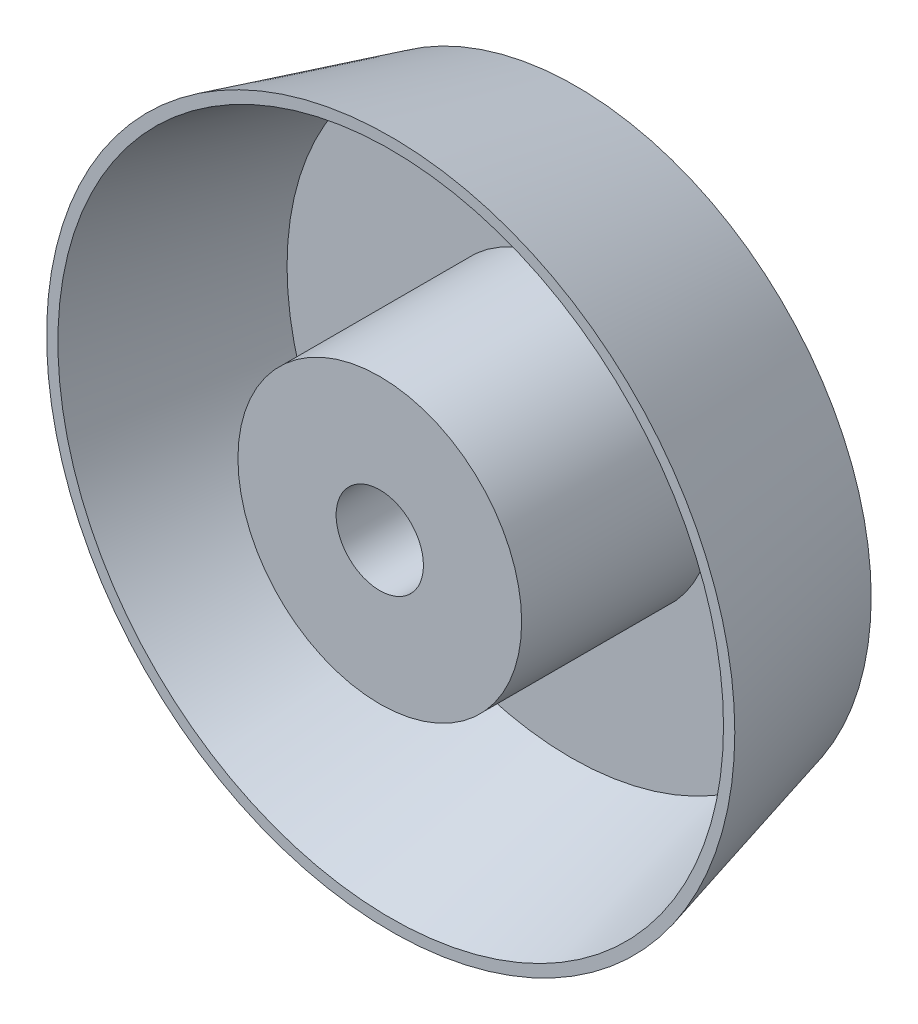
ISO-10303-21;
HEADER;
FILE_DESCRIPTION(('STEP AP214'),'2;1');
FILE_NAME('part.step','',(''),(''),'','','');
FILE_SCHEMA(('AUTOMOTIVE_DESIGN { 1 0 10303 214 1 1 1 1 }'));
ENDSEC;
DATA;
#1=APPLICATION_CONTEXT('core data for automotive mechanical design processes');
#2=APPLICATION_PROTOCOL_DEFINITION('international standard','automotive_design',2000,#1);
#3=PRODUCT_CONTEXT('',#1,'mechanical');
#4=PRODUCT('Part','Part','',(#3));
#5=PRODUCT_RELATED_PRODUCT_CATEGORY('part','',(#4));
#6=PRODUCT_DEFINITION_FORMATION('','',#4);
#7=PRODUCT_DEFINITION_CONTEXT('part definition',#1,'design');
#8=PRODUCT_DEFINITION('design','',#6,#7);
#9=PRODUCT_DEFINITION_SHAPE('','',#8);
#10=(LENGTH_UNIT() NAMED_UNIT(*) SI_UNIT(.MILLI.,.METRE.));
#11=(NAMED_UNIT(*) PLANE_ANGLE_UNIT() SI_UNIT($,.RADIAN.));
#12=(NAMED_UNIT(*) SI_UNIT($,.STERADIAN.) SOLID_ANGLE_UNIT());
#13=UNCERTAINTY_MEASURE_WITH_UNIT(LENGTH_MEASURE(1.E-05),#10,'distance_accuracy_value','');
#14=(GEOMETRIC_REPRESENTATION_CONTEXT(3) GLOBAL_UNCERTAINTY_ASSIGNED_CONTEXT((#13)) GLOBAL_UNIT_ASSIGNED_CONTEXT((#10,
#11,#12)) REPRESENTATION_CONTEXT('',''));
#15=CARTESIAN_POINT('',(0.,0.,0.));
#16=DIRECTION('',(0.,0.,1.));
#17=DIRECTION('',(1.,0.,0.));
#18=AXIS2_PLACEMENT_3D('',#15,#16,#17);
#19=CARTESIAN_POINT('',(0.,0.,0.));
#20=DIRECTION('',(0.,0.,1.));
#21=DIRECTION('',(1.,0.,0.));
#22=AXIS2_PLACEMENT_3D('',#19,#20,#21);
#23=PLANE('',#22);
#24=CARTESIAN_POINT('',(0.,0.,0.));
#25=DIRECTION('',(0.,0.,1.));
#26=DIRECTION('',(1.,0.,0.));
#27=AXIS2_PLACEMENT_3D('',#24,#25,#26);
#28=CIRCLE('',#27,27.0344414938276);
#29=CARTESIAN_POINT('',(27.0344414938276,0.,0.));
#30=VERTEX_POINT('',#29);
#31=EDGE_CURVE('E12',#30,#30,#28,.T.);
#32=ORIENTED_EDGE('',*,*,#31,.F.);
#33=EDGE_LOOP('',(#32));
#34=FACE_BOUND('',#33,.T.);
#35=CARTESIAN_POINT('',(0.,0.,0.));
#36=DIRECTION('',(0.,0.,1.));
#37=DIRECTION('',(1.,0.,0.));
#38=AXIS2_PLACEMENT_3D('',#35,#36,#37);
#39=CIRCLE('',#38,26.);
#40=CARTESIAN_POINT('',(26.,0.,0.));
#41=VERTEX_POINT('',#40);
#42=EDGE_CURVE('E54',#41,#41,#39,.T.);
#43=ORIENTED_EDGE('',*,*,#42,.T.);
#44=EDGE_LOOP('',(#43));
#45=FACE_BOUND('',#44,.T.);
#46=ADVANCED_FACE('F43',(#34,#45),#23,.F.);
#47=CARTESIAN_POINT('',(0.,0.,17.));
#48=DIRECTION('',(0.,0.,1.));
#49=DIRECTION('',(1.,0.,0.));
#50=AXIS2_PLACEMENT_3D('',#47,#48,#49);
#51=PLANE('',#50);
#52=CARTESIAN_POINT('',(0.,0.,17.));
#53=DIRECTION('',(0.,0.,1.));
#54=DIRECTION('',(1.,0.,0.));
#55=AXIS2_PLACEMENT_3D('',#52,#53,#54);
#56=CIRCLE('',#55,30.5);
#57=CARTESIAN_POINT('',(30.5,0.,17.));
#58=VERTEX_POINT('',#57);
#59=EDGE_CURVE('E56',#58,#58,#56,.T.);
#60=ORIENTED_EDGE('',*,*,#59,.F.);
#61=EDGE_LOOP('',(#60));
#62=FACE_BOUND('',#61,.T.);
#63=CARTESIAN_POINT('',(0.,0.,17.));
#64=DIRECTION('',(0.,0.,1.));
#65=DIRECTION('',(1.,0.,0.));
#66=AXIS2_PLACEMENT_3D('',#63,#64,#65);
#67=CIRCLE('',#66,31.5344414938276);
#68=CARTESIAN_POINT('',(31.5344414938276,0.,17.));
#69=VERTEX_POINT('',#68);
#70=EDGE_CURVE('E47',#69,#69,#67,.T.);
#71=ORIENTED_EDGE('',*,*,#70,.T.);
#72=EDGE_LOOP('',(#71));
#73=FACE_BOUND('',#72,.T.);
#74=ADVANCED_FACE('F69',(#62,#73),#51,.T.);
#75=CARTESIAN_POINT('',(0.,0.,-0.255892560316282));
#76=DIRECTION('',(0.,0.,1.));
#77=DIRECTION('',(1.,0.,0.));
#78=AXIS2_PLACEMENT_3D('',#75,#76,#77);
#79=CONICAL_SURFACE('',#78,26.9667052278615,0.258770891963697);
#80=ORIENTED_EDGE('',*,*,#31,.T.);
#81=EDGE_LOOP('',(#80));
#82=FACE_BOUND('',#81,.T.);
#83=ORIENTED_EDGE('',*,*,#70,.F.);
#84=EDGE_LOOP('',(#83));
#85=FACE_BOUND('',#84,.T.);
#86=ADVANCED_FACE('F45',(#82,#85),#79,.T.);
#87=CARTESIAN_POINT('',(0.,0.,0.));
#88=DIRECTION('',(0.,0.,1.));
#89=DIRECTION('',(1.,0.,0.));
#90=AXIS2_PLACEMENT_3D('',#87,#88,#89);
#91=CONICAL_SURFACE('',#90,26.,0.258770891963697);
#92=ORIENTED_EDGE('',*,*,#42,.F.);
#93=EDGE_LOOP('',(#92));
#94=FACE_BOUND('',#93,.T.);
#95=ORIENTED_EDGE('',*,*,#59,.T.);
#96=EDGE_LOOP('',(#95));
#97=FACE_BOUND('',#96,.T.);
#98=ADVANCED_FACE('F63',(#94,#97),#91,.F.);
#99=CLOSED_SHELL('',(#46,#74,#86,#98));
#100=MANIFOLD_SOLID_BREP('B2',#99);
#101=CARTESIAN_POINT('',(0.,0.,0.5));
#102=DIRECTION('',(0.,0.,1.));
#103=DIRECTION('',(1.,0.,0.));
#104=AXIS2_PLACEMENT_3D('',#101,#102,#103);
#105=PLANE('',#104);
#106=CARTESIAN_POINT('',(0.,0.,0.5));
#107=DIRECTION('',(0.,0.,1.));
#108=DIRECTION('',(1.,0.,0.));
#109=AXIS2_PLACEMENT_3D('',#106,#107,#108);
#110=CIRCLE('',#109,26.);
#111=CARTESIAN_POINT('',(26.,0.,0.5));
#112=VERTEX_POINT('',#111);
#113=EDGE_CURVE('E42',#112,#112,#110,.T.);
#114=ORIENTED_EDGE('',*,*,#113,.T.);
#115=EDGE_LOOP('',(#114));
#116=FACE_BOUND('',#115,.T.);
#117=CARTESIAN_POINT('',(0.,0.,0.5));
#118=DIRECTION('',(0.,0.,1.));
#119=DIRECTION('',(1.,0.,0.));
#120=AXIS2_PLACEMENT_3D('',#117,#118,#119);
#121=CIRCLE('',#120,13.);
#122=CARTESIAN_POINT('',(13.,0.,0.5));
#123=VERTEX_POINT('',#122);
#124=EDGE_CURVE('E116',#123,#123,#121,.T.);
#125=ORIENTED_EDGE('',*,*,#124,.F.);
#126=EDGE_LOOP('',(#125));
#127=FACE_BOUND('',#126,.T.);
#128=ADVANCED_FACE('F105',(#116,#127),#105,.T.);
#129=CARTESIAN_POINT('',(0.,0.,0.));
#130=DIRECTION('',(0.,0.,1.));
#131=DIRECTION('',(1.,0.,0.));
#132=AXIS2_PLACEMENT_3D('',#129,#130,#131);
#133=PLANE('',#132);
#134=CARTESIAN_POINT('',(0.,0.,0.));
#135=DIRECTION('',(0.,0.,1.));
#136=DIRECTION('',(1.,0.,0.));
#137=AXIS2_PLACEMENT_3D('',#134,#135,#136);
#138=CIRCLE('',#137,26.);
#139=CARTESIAN_POINT('',(26.,0.,0.));
#140=VERTEX_POINT('',#139);
#141=EDGE_CURVE('E109',#140,#140,#138,.T.);
#142=ORIENTED_EDGE('',*,*,#141,.F.);
#143=EDGE_LOOP('',(#142));
#144=FACE_BOUND('',#143,.T.);
#145=CARTESIAN_POINT('',(0.,0.,0.));
#146=DIRECTION('',(0.,0.,1.));
#147=DIRECTION('',(1.,0.,0.));
#148=AXIS2_PLACEMENT_3D('',#145,#146,#147);
#149=CIRCLE('',#148,4.);
#150=CARTESIAN_POINT('',(4.,0.,0.));
#151=VERTEX_POINT('',#150);
#152=EDGE_CURVE('E124',#151,#151,#149,.T.);
#153=ORIENTED_EDGE('',*,*,#152,.T.);
#154=EDGE_LOOP('',(#153));
#155=FACE_BOUND('',#154,.T.);
#156=ADVANCED_FACE('F144',(#144,#155),#133,.F.);
#157=CARTESIAN_POINT('',(0.,0.,0.5));
#158=DIRECTION('',(0.,0.,-1.));
#159=DIRECTION('',(-1.,0.,0.));
#160=AXIS2_PLACEMENT_3D('',#157,#158,#159);
#161=CYLINDRICAL_SURFACE('',#160,26.);
#162=ORIENTED_EDGE('',*,*,#113,.F.);
#163=EDGE_LOOP('',(#162));
#164=FACE_BOUND('',#163,.T.);
#165=ORIENTED_EDGE('',*,*,#141,.T.);
#166=EDGE_LOOP('',(#165));
#167=FACE_BOUND('',#166,.T.);
#168=ADVANCED_FACE('F107',(#164,#167),#161,.T.);
#169=CARTESIAN_POINT('',(0.,0.,18.));
#170=DIRECTION('',(0.,0.,1.));
#171=DIRECTION('',(1.,0.,0.));
#172=AXIS2_PLACEMENT_3D('',#169,#170,#171);
#173=PLANE('',#172);
#174=CARTESIAN_POINT('',(0.,0.,18.));
#175=DIRECTION('',(0.,0.,1.));
#176=DIRECTION('',(1.,0.,0.));
#177=AXIS2_PLACEMENT_3D('',#174,#175,#176);
#178=CIRCLE('',#177,13.);
#179=CARTESIAN_POINT('',(13.,0.,18.));
#180=VERTEX_POINT('',#179);
#181=EDGE_CURVE('E120',#180,#180,#178,.T.);
#182=ORIENTED_EDGE('',*,*,#181,.T.);
#183=EDGE_LOOP('',(#182));
#184=FACE_BOUND('',#183,.T.);
#185=CARTESIAN_POINT('',(0.,0.,18.));
#186=DIRECTION('',(0.,0.,1.));
#187=DIRECTION('',(1.,0.,0.));
#188=AXIS2_PLACEMENT_3D('',#185,#186,#187);
#189=CIRCLE('',#188,4.);
#190=CARTESIAN_POINT('',(4.,0.,18.));
#191=VERTEX_POINT('',#190);
#192=EDGE_CURVE('E123',#191,#191,#189,.T.);
#193=ORIENTED_EDGE('',*,*,#192,.F.);
#194=EDGE_LOOP('',(#193));
#195=FACE_BOUND('',#194,.T.);
#196=ADVANCED_FACE('F133',(#184,#195),#173,.T.);
#197=CARTESIAN_POINT('',(0.,0.,18.));
#198=DIRECTION('',(0.,0.,-1.));
#199=DIRECTION('',(-1.,0.,0.));
#200=AXIS2_PLACEMENT_3D('',#197,#198,#199);
#201=CYLINDRICAL_SURFACE('',#200,13.);
#202=ORIENTED_EDGE('',*,*,#124,.T.);
#203=EDGE_LOOP('',(#202));
#204=FACE_BOUND('',#203,.T.);
#205=ORIENTED_EDGE('',*,*,#181,.F.);
#206=EDGE_LOOP('',(#205));
#207=FACE_BOUND('',#206,.T.);
#208=ADVANCED_FACE('F135',(#204,#207),#201,.T.);
#209=CARTESIAN_POINT('',(0.,0.,18.));
#210=DIRECTION('',(0.,0.,-1.));
#211=DIRECTION('',(-1.,0.,0.));
#212=AXIS2_PLACEMENT_3D('',#209,#210,#211);
#213=CYLINDRICAL_SURFACE('',#212,4.);
#214=ORIENTED_EDGE('',*,*,#192,.T.);
#215=EDGE_LOOP('',(#214));
#216=FACE_BOUND('',#215,.T.);
#217=ORIENTED_EDGE('',*,*,#152,.F.);
#218=EDGE_LOOP('',(#217));
#219=FACE_BOUND('',#218,.T.);
#220=ADVANCED_FACE('F130',(#216,#219),#213,.F.);
#221=CLOSED_SHELL('',(#128,#156,#168,#196,#208,#220));
#222=MANIFOLD_SOLID_BREP('B7',#221);
#223=ADVANCED_BREP_SHAPE_REPRESENTATION('',(#18,#100,#222),#14);
#224=SHAPE_DEFINITION_REPRESENTATION(#9,#223);
ENDSEC;
END-ISO-10303-21;
